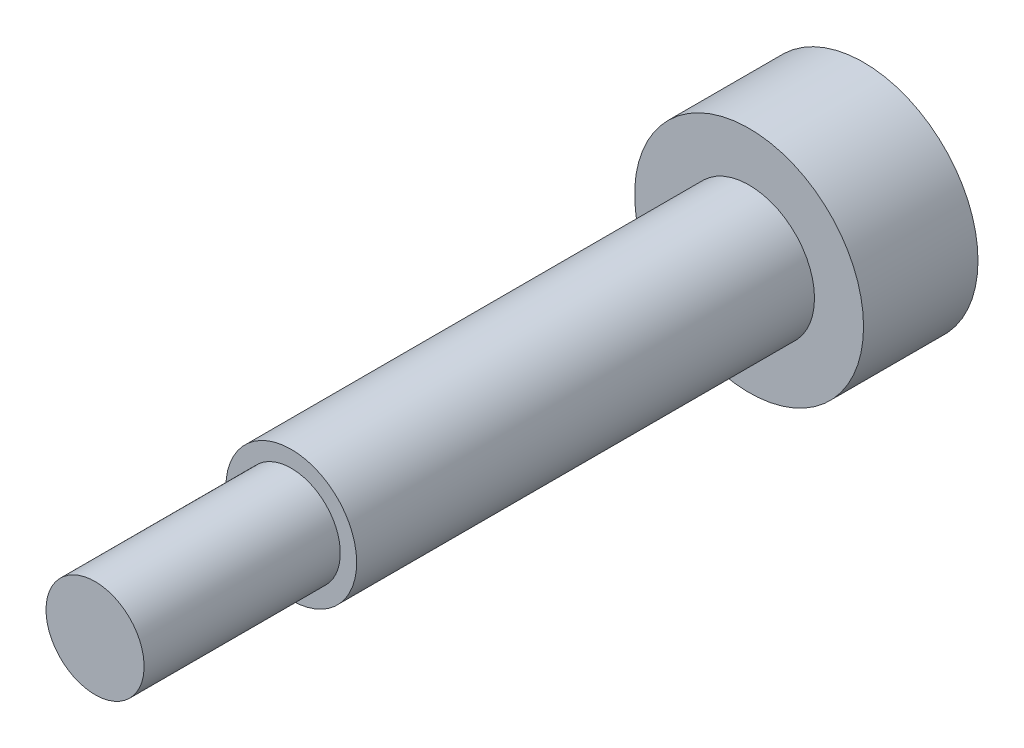
ISO-10303-21;
HEADER;
FILE_DESCRIPTION(('STEP AP214'),'2;1');
FILE_NAME('part.step','',(''),(''),'','','');
FILE_SCHEMA(('AUTOMOTIVE_DESIGN { 1 0 10303 214 1 1 1 1 }'));
ENDSEC;
DATA;
#1=APPLICATION_CONTEXT('core data for automotive mechanical design processes');
#2=APPLICATION_PROTOCOL_DEFINITION('international standard','automotive_design',2000,#1);
#3=PRODUCT_CONTEXT('',#1,'mechanical');
#4=PRODUCT('Part','Part','',(#3));
#5=PRODUCT_RELATED_PRODUCT_CATEGORY('part','',(#4));
#6=PRODUCT_DEFINITION_FORMATION('','',#4);
#7=PRODUCT_DEFINITION_CONTEXT('part definition',#1,'design');
#8=PRODUCT_DEFINITION('design','',#6,#7);
#9=PRODUCT_DEFINITION_SHAPE('','',#8);
#10=(LENGTH_UNIT() NAMED_UNIT(*) SI_UNIT(.MILLI.,.METRE.));
#11=(NAMED_UNIT(*) PLANE_ANGLE_UNIT() SI_UNIT($,.RADIAN.));
#12=(NAMED_UNIT(*) SI_UNIT($,.STERADIAN.) SOLID_ANGLE_UNIT());
#13=UNCERTAINTY_MEASURE_WITH_UNIT(LENGTH_MEASURE(1.E-05),#10,'distance_accuracy_value','');
#14=(GEOMETRIC_REPRESENTATION_CONTEXT(3) GLOBAL_UNCERTAINTY_ASSIGNED_CONTEXT((#13)) GLOBAL_UNIT_ASSIGNED_CONTEXT((#10,
#11,#12)) REPRESENTATION_CONTEXT('',''));
#15=CARTESIAN_POINT('',(0.,0.,0.));
#16=DIRECTION('',(0.,0.,1.));
#17=DIRECTION('',(1.,0.,0.));
#18=AXIS2_PLACEMENT_3D('',#15,#16,#17);
#19=CARTESIAN_POINT('',(0.,0.,-3.5));
#20=DIRECTION('',(0.,0.,1.));
#21=DIRECTION('',(-1.,0.,0.));
#22=AXIS2_PLACEMENT_3D('',#19,#20,#21);
#23=CYLINDRICAL_SURFACE('',#22,3.5);
#24=CARTESIAN_POINT('',(0.,0.,-3.5));
#25=DIRECTION('',(0.,0.,1.));
#26=DIRECTION('',(1.,0.,0.));
#27=AXIS2_PLACEMENT_3D('',#24,#25,#26);
#28=CIRCLE('',#27,3.5);
#29=CARTESIAN_POINT('',(3.5,0.,-3.5));
#30=VERTEX_POINT('',#29);
#31=EDGE_CURVE('E46',#30,#30,#28,.T.);
#32=ORIENTED_EDGE('',*,*,#31,.T.);
#33=EDGE_LOOP('',(#32));
#34=FACE_BOUND('',#33,.T.);
#35=CARTESIAN_POINT('',(0.,0.,0.));
#36=DIRECTION('',(0.,0.,1.));
#37=DIRECTION('',(1.,0.,0.));
#38=AXIS2_PLACEMENT_3D('',#35,#36,#37);
#39=CIRCLE('',#38,3.5);
#40=CARTESIAN_POINT('',(3.5,0.,0.));
#41=VERTEX_POINT('',#40);
#42=EDGE_CURVE('E129',#41,#41,#39,.T.);
#43=ORIENTED_EDGE('',*,*,#42,.F.);
#44=EDGE_LOOP('',(#43));
#45=FACE_BOUND('',#44,.T.);
#46=ADVANCED_FACE('F39',(#34,#45),#23,.T.);
#47=CARTESIAN_POINT('',(0.,0.,-3.5));
#48=DIRECTION('',(0.,0.,-1.));
#49=DIRECTION('',(1.,0.,0.));
#50=AXIS2_PLACEMENT_3D('',#47,#48,#49);
#51=PLANE('',#50);
#52=DIRECTION('',(-0.483885708586405,0.875131202178183,0.));
#53=VECTOR('',#52,1.);
#54=CARTESIAN_POINT('',(1.73175411943134,-0.0320572898511147,-3.5));
#55=LINE('',#54,#53);
#56=CARTESIAN_POINT('',(1.73175411943134,-0.0320572898511147,-3.5));
#57=VERTEX_POINT('',#56);
#58=CARTESIAN_POINT('',(0.893639487103215,1.48371441561033,-3.5));
#59=VERTEX_POINT('',#58);
#60=EDGE_CURVE('E146',#57,#59,#55,.T.);
#61=ORIENTED_EDGE('',*,*,#60,.T.);
#62=DIRECTION('',(-0.999828707023925,0.0185082849250311,0.));
#63=VECTOR('',#62,1.);
#64=CARTESIAN_POINT('',(0.893639487103215,1.48371441561033,-3.5));
#65=LINE('',#64,#63);
#66=CARTESIAN_POINT('',(-0.838114632328121,1.51577170546145,-3.5));
#67=VERTEX_POINT('',#66);
#68=EDGE_CURVE('E143',#59,#67,#65,.T.);
#69=ORIENTED_EDGE('',*,*,#68,.T.);
#70=DIRECTION('',(-0.51594299843752,-0.856622917253152,0.));
#71=VECTOR('',#70,1.);
#72=CARTESIAN_POINT('',(-0.838114632328121,1.51577170546145,-3.5));
#73=LINE('',#72,#71);
#74=CARTESIAN_POINT('',(-1.73175411943134,0.0320572898511147,-3.5));
#75=VERTEX_POINT('',#74);
#76=EDGE_CURVE('E140',#67,#75,#73,.T.);
#77=ORIENTED_EDGE('',*,*,#76,.T.);
#78=DIRECTION('',(0.483885708586405,-0.875131202178183,0.));
#79=VECTOR('',#78,1.);
#80=CARTESIAN_POINT('',(-1.73175411943134,0.0320572898511147,-3.5));
#81=LINE('',#80,#79);
#82=CARTESIAN_POINT('',(-0.893639487103214,-1.48371441561033,-3.5));
#83=VERTEX_POINT('',#82);
#84=EDGE_CURVE('E138',#75,#83,#81,.T.);
#85=ORIENTED_EDGE('',*,*,#84,.T.);
#86=DIRECTION('',(0.999828707023925,-0.0185082849250311,0.));
#87=VECTOR('',#86,1.);
#88=CARTESIAN_POINT('',(-0.893639487103214,-1.48371441561033,-3.5));
#89=LINE('',#88,#87);
#90=CARTESIAN_POINT('',(0.838114632328121,-1.51577170546145,-3.5));
#91=VERTEX_POINT('',#90);
#92=EDGE_CURVE('E117',#83,#91,#89,.T.);
#93=ORIENTED_EDGE('',*,*,#92,.T.);
#94=DIRECTION('',(0.51594299843752,0.856622917253152,0.));
#95=VECTOR('',#94,1.);
#96=CARTESIAN_POINT('',(0.838114632328121,-1.51577170546145,-3.5));
#97=LINE('',#96,#95);
#98=EDGE_CURVE('E134',#91,#57,#97,.T.);
#99=ORIENTED_EDGE('',*,*,#98,.T.);
#100=EDGE_LOOP('',(#61,#69,#77,#85,#93,#99));
#101=FACE_BOUND('',#100,.T.);
#102=ORIENTED_EDGE('',*,*,#31,.F.);
#103=EDGE_LOOP('',(#102));
#104=FACE_BOUND('',#103,.T.);
#105=ADVANCED_FACE('F175',(#101,#104),#51,.T.);
#106=CARTESIAN_POINT('',(0.,0.,0.));
#107=DIRECTION('',(0.,0.,-1.));
#108=DIRECTION('',(1.,0.,0.));
#109=AXIS2_PLACEMENT_3D('',#106,#107,#108);
#110=PLANE('',#109);
#111=CARTESIAN_POINT('',(0.,0.,0.));
#112=DIRECTION('',(0.,0.,1.));
#113=DIRECTION('',(1.,0.,0.));
#114=AXIS2_PLACEMENT_3D('',#111,#112,#113);
#115=CIRCLE('',#114,2.);
#116=CARTESIAN_POINT('',(2.,0.,0.));
#117=VERTEX_POINT('',#116);
#118=EDGE_CURVE('E11',#117,#117,#115,.F.);
#119=ORIENTED_EDGE('',*,*,#118,.T.);
#120=EDGE_LOOP('',(#119));
#121=FACE_BOUND('',#120,.T.);
#122=ORIENTED_EDGE('',*,*,#42,.T.);
#123=EDGE_LOOP('',(#122));
#124=FACE_BOUND('',#123,.T.);
#125=ADVANCED_FACE('F180',(#121,#124),#110,.F.);
#126=CARTESIAN_POINT('',(1.73175411943134,-0.0320572898511147,-1.5));
#127=DIRECTION('',(0.875131202178183,0.483885708586405,0.));
#128=DIRECTION('',(-0.483885708586405,0.875131202178183,0.));
#129=AXIS2_PLACEMENT_3D('',#126,#127,#128);
#130=PLANE('',#129);
#131=ORIENTED_EDGE('',*,*,#60,.F.);
#132=DIRECTION('',(0.,0.,-1.));
#133=VECTOR('',#132,1.);
#134=CARTESIAN_POINT('',(1.73175411943134,-0.0320572898511147,-1.5));
#135=LINE('',#134,#133);
#136=CARTESIAN_POINT('',(1.73175411943134,-0.0320572898511147,-1.5));
#137=VERTEX_POINT('',#136);
#138=EDGE_CURVE('E84',#137,#57,#135,.T.);
#139=ORIENTED_EDGE('',*,*,#138,.F.);
#140=DIRECTION('',(-0.483885708586405,0.875131202178183,0.));
#141=VECTOR('',#140,1.);
#142=CARTESIAN_POINT('',(1.73175411943134,-0.0320572898511147,-1.5));
#143=LINE('',#142,#141);
#144=CARTESIAN_POINT('',(0.893639487103215,1.48371441561033,-1.5));
#145=VERTEX_POINT('',#144);
#146=EDGE_CURVE('E136',#137,#145,#143,.T.);
#147=ORIENTED_EDGE('',*,*,#146,.T.);
#148=DIRECTION('',(0.,0.,-1.));
#149=VECTOR('',#148,1.);
#150=CARTESIAN_POINT('',(0.893639487103215,1.48371441561033,-1.5));
#151=LINE('',#150,#149);
#152=EDGE_CURVE('E53',#145,#59,#151,.T.);
#153=ORIENTED_EDGE('',*,*,#152,.T.);
#154=EDGE_LOOP('',(#131,#139,#147,#153));
#155=FACE_BOUND('',#154,.T.);
#156=ADVANCED_FACE('F189',(#155),#130,.F.);
#157=CARTESIAN_POINT('',(0.838114632328121,-1.51577170546145,-1.5));
#158=DIRECTION('',(0.856622917253152,-0.51594299843752,0.));
#159=DIRECTION('',(0.51594299843752,0.856622917253153,0.));
#160=AXIS2_PLACEMENT_3D('',#157,#158,#159);
#161=PLANE('',#160);
#162=ORIENTED_EDGE('',*,*,#98,.F.);
#163=DIRECTION('',(0.,0.,-1.));
#164=VECTOR('',#163,1.);
#165=CARTESIAN_POINT('',(0.838114632328121,-1.51577170546145,-1.5));
#166=LINE('',#165,#164);
#167=CARTESIAN_POINT('',(0.838114632328121,-1.51577170546145,-1.5));
#168=VERTEX_POINT('',#167);
#169=EDGE_CURVE('E119',#168,#91,#166,.T.);
#170=ORIENTED_EDGE('',*,*,#169,.F.);
#171=DIRECTION('',(0.51594299843752,0.856622917253152,0.));
#172=VECTOR('',#171,1.);
#173=CARTESIAN_POINT('',(0.838114632328121,-1.51577170546145,-1.5));
#174=LINE('',#173,#172);
#175=EDGE_CURVE('E62',#168,#137,#174,.T.);
#176=ORIENTED_EDGE('',*,*,#175,.T.);
#177=ORIENTED_EDGE('',*,*,#138,.T.);
#178=EDGE_LOOP('',(#162,#170,#176,#177));
#179=FACE_BOUND('',#178,.T.);
#180=ADVANCED_FACE('F194',(#179),#161,.F.);
#181=CARTESIAN_POINT('',(-0.893639487103214,-1.48371441561033,-1.5));
#182=DIRECTION('',(-0.0185082849250311,-0.999828707023925,0.));
#183=DIRECTION('',(0.999828707023925,-0.0185082849250311,0.));
#184=AXIS2_PLACEMENT_3D('',#181,#182,#183);
#185=PLANE('',#184);
#186=ORIENTED_EDGE('',*,*,#92,.F.);
#187=DIRECTION('',(0.,0.,-1.));
#188=VECTOR('',#187,1.);
#189=CARTESIAN_POINT('',(-0.893639487103214,-1.48371441561033,-1.5));
#190=LINE('',#189,#188);
#191=CARTESIAN_POINT('',(-0.893639487103214,-1.48371441561033,-1.5));
#192=VERTEX_POINT('',#191);
#193=EDGE_CURVE('E106',#192,#83,#190,.T.);
#194=ORIENTED_EDGE('',*,*,#193,.F.);
#195=DIRECTION('',(0.999828707023925,-0.0185082849250311,0.));
#196=VECTOR('',#195,1.);
#197=CARTESIAN_POINT('',(-0.893639487103214,-1.48371441561033,-1.5));
#198=LINE('',#197,#196);
#199=EDGE_CURVE('E109',#192,#168,#198,.T.);
#200=ORIENTED_EDGE('',*,*,#199,.T.);
#201=ORIENTED_EDGE('',*,*,#169,.T.);
#202=EDGE_LOOP('',(#186,#194,#200,#201));
#203=FACE_BOUND('',#202,.T.);
#204=ADVANCED_FACE('F115',(#203),#185,.F.);
#205=CARTESIAN_POINT('',(-1.73175411943134,0.0320572898511147,-1.5));
#206=DIRECTION('',(-0.875131202178183,-0.483885708586405,0.));
#207=DIRECTION('',(0.483885708586405,-0.875131202178183,0.));
#208=AXIS2_PLACEMENT_3D('',#205,#206,#207);
#209=PLANE('',#208);
#210=ORIENTED_EDGE('',*,*,#84,.F.);
#211=DIRECTION('',(0.,0.,-1.));
#212=VECTOR('',#211,1.);
#213=CARTESIAN_POINT('',(-1.73175411943134,0.0320572898511147,-1.5));
#214=LINE('',#213,#212);
#215=CARTESIAN_POINT('',(-1.73175411943134,0.0320572898511147,-1.5));
#216=VERTEX_POINT('',#215);
#217=EDGE_CURVE('E108',#216,#75,#214,.T.);
#218=ORIENTED_EDGE('',*,*,#217,.F.);
#219=DIRECTION('',(0.483885708586405,-0.875131202178183,0.));
#220=VECTOR('',#219,1.);
#221=CARTESIAN_POINT('',(-1.73175411943134,0.0320572898511147,-1.5));
#222=LINE('',#221,#220);
#223=EDGE_CURVE('E101',#216,#192,#222,.T.);
#224=ORIENTED_EDGE('',*,*,#223,.T.);
#225=ORIENTED_EDGE('',*,*,#193,.T.);
#226=EDGE_LOOP('',(#210,#218,#224,#225));
#227=FACE_BOUND('',#226,.T.);
#228=ADVANCED_FACE('F104',(#227),#209,.F.);
#229=CARTESIAN_POINT('',(-0.838114632328121,1.51577170546145,-1.5));
#230=DIRECTION('',(-0.856622917253152,0.51594299843752,0.));
#231=DIRECTION('',(-0.51594299843752,-0.856622917253153,0.));
#232=AXIS2_PLACEMENT_3D('',#229,#230,#231);
#233=PLANE('',#232);
#234=ORIENTED_EDGE('',*,*,#76,.F.);
#235=DIRECTION('',(0.,0.,-1.));
#236=VECTOR('',#235,1.);
#237=CARTESIAN_POINT('',(-0.838114632328121,1.51577170546145,-1.5));
#238=LINE('',#237,#236);
#239=CARTESIAN_POINT('',(-0.838114632328121,1.51577170546145,-1.5));
#240=VERTEX_POINT('',#239);
#241=EDGE_CURVE('E122',#240,#67,#238,.T.);
#242=ORIENTED_EDGE('',*,*,#241,.F.);
#243=DIRECTION('',(-0.51594299843752,-0.856622917253152,0.));
#244=VECTOR('',#243,1.);
#245=CARTESIAN_POINT('',(-0.838114632328121,1.51577170546145,-1.5));
#246=LINE('',#245,#244);
#247=EDGE_CURVE('E110',#240,#216,#246,.T.);
#248=ORIENTED_EDGE('',*,*,#247,.T.);
#249=ORIENTED_EDGE('',*,*,#217,.T.);
#250=EDGE_LOOP('',(#234,#242,#248,#249));
#251=FACE_BOUND('',#250,.T.);
#252=ADVANCED_FACE('F198',(#251),#233,.F.);
#253=CARTESIAN_POINT('',(0.893639487103215,1.48371441561033,-1.5));
#254=DIRECTION('',(0.0185082849250311,0.999828707023925,0.));
#255=DIRECTION('',(-0.999828707023925,0.0185082849250311,0.));
#256=AXIS2_PLACEMENT_3D('',#253,#254,#255);
#257=PLANE('',#256);
#258=ORIENTED_EDGE('',*,*,#68,.F.);
#259=ORIENTED_EDGE('',*,*,#152,.F.);
#260=DIRECTION('',(-0.999828707023925,0.0185082849250311,0.));
#261=VECTOR('',#260,1.);
#262=CARTESIAN_POINT('',(0.893639487103215,1.48371441561033,-1.5));
#263=LINE('',#262,#261);
#264=EDGE_CURVE('E92',#145,#240,#263,.T.);
#265=ORIENTED_EDGE('',*,*,#264,.T.);
#266=ORIENTED_EDGE('',*,*,#241,.T.);
#267=EDGE_LOOP('',(#258,#259,#265,#266));
#268=FACE_BOUND('',#267,.T.);
#269=ADVANCED_FACE('F195',(#268),#257,.F.);
#270=CARTESIAN_POINT('',(0.,0.,-1.5));
#271=DIRECTION('',(0.,0.,-1.));
#272=DIRECTION('',(1.,0.,0.));
#273=AXIS2_PLACEMENT_3D('',#270,#271,#272);
#274=PLANE('',#273);
#275=ORIENTED_EDGE('',*,*,#146,.F.);
#276=ORIENTED_EDGE('',*,*,#175,.F.);
#277=ORIENTED_EDGE('',*,*,#199,.F.);
#278=ORIENTED_EDGE('',*,*,#223,.F.);
#279=ORIENTED_EDGE('',*,*,#247,.F.);
#280=ORIENTED_EDGE('',*,*,#264,.F.);
#281=EDGE_LOOP('',(#275,#276,#277,#278,#279,#280));
#282=FACE_BOUND('',#281,.T.);
#283=ADVANCED_FACE('F112',(#282),#274,.T.);
#284=CARTESIAN_POINT('',(0.,0.,14.));
#285=DIRECTION('',(0.,0.,-1.));
#286=DIRECTION('',(1.,0.,0.));
#287=AXIS2_PLACEMENT_3D('',#284,#285,#286);
#288=CYLINDRICAL_SURFACE('',#287,2.);
#289=CARTESIAN_POINT('',(0.,0.,14.));
#290=DIRECTION('',(0.,0.,-1.));
#291=DIRECTION('',(-1.,0.,0.));
#292=AXIS2_PLACEMENT_3D('',#289,#290,#291);
#293=CIRCLE('',#292,2.);
#294=CARTESIAN_POINT('',(-2.,0.,14.));
#295=VERTEX_POINT('',#294);
#296=EDGE_CURVE('E149',#295,#295,#293,.T.);
#297=ORIENTED_EDGE('',*,*,#296,.T.);
#298=EDGE_LOOP('',(#297));
#299=FACE_BOUND('',#298,.T.);
#300=ORIENTED_EDGE('',*,*,#118,.F.);
#301=EDGE_LOOP('',(#300));
#302=FACE_BOUND('',#301,.T.);
#303=ADVANCED_FACE('F211',(#299,#302),#288,.T.);
#304=CARTESIAN_POINT('',(0.,0.,14.));
#305=DIRECTION('',(0.,0.,1.));
#306=DIRECTION('',(-1.,0.,0.));
#307=AXIS2_PLACEMENT_3D('',#304,#305,#306);
#308=PLANE('',#307);
#309=CARTESIAN_POINT('',(0.,0.,14.));
#310=DIRECTION('',(0.,0.,-1.));
#311=DIRECTION('',(-1.,0.,0.));
#312=AXIS2_PLACEMENT_3D('',#309,#310,#311);
#313=CIRCLE('',#312,1.5);
#314=CARTESIAN_POINT('',(-1.5,0.,14.));
#315=VERTEX_POINT('',#314);
#316=EDGE_CURVE('E157',#315,#315,#313,.T.);
#317=ORIENTED_EDGE('',*,*,#316,.T.);
#318=EDGE_LOOP('',(#317));
#319=FACE_BOUND('',#318,.T.);
#320=ORIENTED_EDGE('',*,*,#296,.F.);
#321=EDGE_LOOP('',(#320));
#322=FACE_BOUND('',#321,.T.);
#323=ADVANCED_FACE('F172',(#319,#322),#308,.T.);
#324=CARTESIAN_POINT('',(0.,0.,20.));
#325=DIRECTION('',(0.,0.,-1.));
#326=DIRECTION('',(1.,0.,0.));
#327=AXIS2_PLACEMENT_3D('',#324,#325,#326);
#328=CYLINDRICAL_SURFACE('',#327,1.5);
#329=CARTESIAN_POINT('',(0.,0.,20.));
#330=DIRECTION('',(0.,0.,-1.));
#331=DIRECTION('',(-1.,0.,0.));
#332=AXIS2_PLACEMENT_3D('',#329,#330,#331);
#333=CIRCLE('',#332,1.5);
#334=CARTESIAN_POINT('',(-1.5,0.,20.));
#335=VERTEX_POINT('',#334);
#336=EDGE_CURVE('E156',#335,#335,#333,.T.);
#337=ORIENTED_EDGE('',*,*,#336,.T.);
#338=EDGE_LOOP('',(#337));
#339=FACE_BOUND('',#338,.T.);
#340=ORIENTED_EDGE('',*,*,#316,.F.);
#341=EDGE_LOOP('',(#340));
#342=FACE_BOUND('',#341,.T.);
#343=ADVANCED_FACE('F163',(#339,#342),#328,.T.);
#344=CARTESIAN_POINT('',(0.,0.,20.));
#345=DIRECTION('',(0.,0.,1.));
#346=DIRECTION('',(-1.,0.,0.));
#347=AXIS2_PLACEMENT_3D('',#344,#345,#346);
#348=PLANE('',#347);
#349=ORIENTED_EDGE('',*,*,#336,.F.);
#350=EDGE_LOOP('',(#349));
#351=FACE_BOUND('',#350,.T.);
#352=ADVANCED_FACE('F166',(#351),#348,.T.);
#353=CLOSED_SHELL('',(#46,#105,#125,#156,#180,#204,#228,#252,#269,#283,#303,#323,#343,#352));
#354=MANIFOLD_SOLID_BREP('B2',#353);
#355=ADVANCED_BREP_SHAPE_REPRESENTATION('',(#18,#354),#14);
#356=SHAPE_DEFINITION_REPRESENTATION(#9,#355);
ENDSEC;
END-ISO-10303-21;
